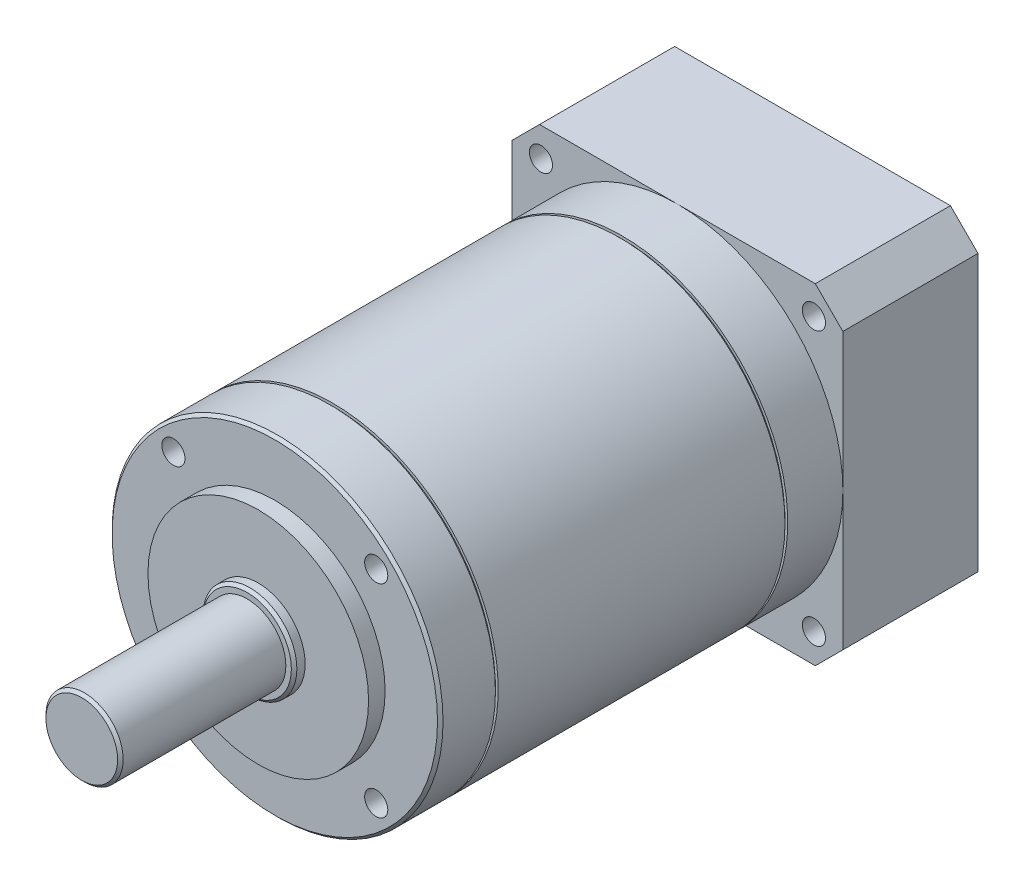
ISO-10303-21;
HEADER;
FILE_DESCRIPTION(('STEP AP214'),'2;1');
FILE_NAME('part.step','',(''),(''),'','','');
FILE_SCHEMA(('AUTOMOTIVE_DESIGN { 1 0 10303 214 1 1 1 1 }'));
ENDSEC;
DATA;
#1=APPLICATION_CONTEXT('core data for automotive mechanical design processes');
#2=APPLICATION_PROTOCOL_DEFINITION('international standard','automotive_design',2000,#1);
#3=PRODUCT_CONTEXT('',#1,'mechanical');
#4=PRODUCT('Part','Part','',(#3));
#5=PRODUCT_RELATED_PRODUCT_CATEGORY('part','',(#4));
#6=PRODUCT_DEFINITION_FORMATION('','',#4);
#7=PRODUCT_DEFINITION_CONTEXT('part definition',#1,'design');
#8=PRODUCT_DEFINITION('design','',#6,#7);
#9=PRODUCT_DEFINITION_SHAPE('','',#8);
#10=(LENGTH_UNIT() NAMED_UNIT(*) SI_UNIT(.MILLI.,.METRE.));
#11=(NAMED_UNIT(*) PLANE_ANGLE_UNIT() SI_UNIT($,.RADIAN.));
#12=(NAMED_UNIT(*) SI_UNIT($,.STERADIAN.) SOLID_ANGLE_UNIT());
#13=UNCERTAINTY_MEASURE_WITH_UNIT(LENGTH_MEASURE(1.E-05),#10,'distance_accuracy_value','');
#14=(GEOMETRIC_REPRESENTATION_CONTEXT(3) GLOBAL_UNCERTAINTY_ASSIGNED_CONTEXT((#13)) GLOBAL_UNIT_ASSIGNED_CONTEXT((#10,
#11,#12)) REPRESENTATION_CONTEXT('',''));
#15=CARTESIAN_POINT('',(0.,0.,0.));
#16=DIRECTION('',(0.,0.,1.));
#17=DIRECTION('',(1.,0.,0.));
#18=AXIS2_PLACEMENT_3D('',#15,#16,#17);
#19=CARTESIAN_POINT('',(0.,0.,100.5));
#20=DIRECTION('',(0.,0.,1.));
#21=DIRECTION('',(1.,0.,0.));
#22=AXIS2_PLACEMENT_3D('',#19,#20,#21);
#23=PLANE('',#22);
#24=CARTESIAN_POINT('',(0.,0.,100.5));
#25=DIRECTION('',(0.,0.,1.));
#26=DIRECTION('',(1.,0.,0.));
#27=AXIS2_PLACEMENT_3D('',#24,#25,#26);
#28=CIRCLE('',#27,20.);
#29=CARTESIAN_POINT('',(20.,0.,100.5));
#30=VERTEX_POINT('',#29);
#31=EDGE_CURVE('E168',#30,#30,#28,.T.);
#32=ORIENTED_EDGE('',*,*,#31,.T.);
#33=EDGE_LOOP('',(#32));
#34=FACE_BOUND('',#33,.T.);
#35=CARTESIAN_POINT('',(0.,0.,100.5));
#36=DIRECTION('',(0.,0.,1.));
#37=DIRECTION('',(1.,0.,0.));
#38=AXIS2_PLACEMENT_3D('',#35,#36,#37);
#39=CIRCLE('',#38,8.5);
#40=CARTESIAN_POINT('',(8.5,0.,100.5));
#41=VERTEX_POINT('',#40);
#42=EDGE_CURVE('E164',#41,#41,#39,.T.);
#43=ORIENTED_EDGE('',*,*,#42,.F.);
#44=EDGE_LOOP('',(#43));
#45=FACE_BOUND('',#44,.T.);
#46=ADVANCED_FACE('F41',(#34,#45),#23,.T.);
#47=CARTESIAN_POINT('',(0.,0.,97.5));
#48=DIRECTION('',(0.,0.,1.));
#49=DIRECTION('',(1.,0.,0.));
#50=AXIS2_PLACEMENT_3D('',#47,#48,#49);
#51=PLANE('',#50);
#52=CARTESIAN_POINT('',(0.,0.,97.5));
#53=DIRECTION('',(0.,0.,1.));
#54=DIRECTION('',(1.,0.,0.));
#55=AXIS2_PLACEMENT_3D('',#52,#53,#54);
#56=CIRCLE('',#55,29.5);
#57=CARTESIAN_POINT('',(29.5,0.,97.5));
#58=VERTEX_POINT('',#57);
#59=EDGE_CURVE('E283',#58,#58,#56,.T.);
#60=ORIENTED_EDGE('',*,*,#59,.T.);
#61=EDGE_LOOP('',(#60));
#62=FACE_BOUND('',#61,.T.);
#63=CARTESIAN_POINT('',(-18.38477631085,18.3847763108504,97.5));
#64=DIRECTION('',(0.,0.,1.));
#65=DIRECTION('',(1.,0.,0.));
#66=AXIS2_PLACEMENT_3D('',#63,#64,#65);
#67=CIRCLE('',#66,2.09999999999999);
#68=CARTESIAN_POINT('',(-16.28477631085,18.3847763108504,97.5));
#69=VERTEX_POINT('',#68);
#70=EDGE_CURVE('E140',#69,#69,#67,.T.);
#71=ORIENTED_EDGE('',*,*,#70,.F.);
#72=EDGE_LOOP('',(#71));
#73=FACE_BOUND('',#72,.T.);
#74=CARTESIAN_POINT('',(-18.3847763108502,-18.3847763108502,97.5));
#75=DIRECTION('',(0.,0.,1.));
#76=DIRECTION('',(1.,0.,0.));
#77=AXIS2_PLACEMENT_3D('',#74,#75,#76);
#78=CIRCLE('',#77,2.09999999999999);
#79=CARTESIAN_POINT('',(-16.2847763108503,-18.3847763108502,97.5));
#80=VERTEX_POINT('',#79);
#81=EDGE_CURVE('E139',#80,#80,#78,.T.);
#82=ORIENTED_EDGE('',*,*,#81,.F.);
#83=EDGE_LOOP('',(#82));
#84=FACE_BOUND('',#83,.T.);
#85=CARTESIAN_POINT('',(18.3847763108502,-18.3847763108503,97.5));
#86=DIRECTION('',(0.,0.,1.));
#87=DIRECTION('',(1.,0.,0.));
#88=AXIS2_PLACEMENT_3D('',#85,#86,#87);
#89=CIRCLE('',#88,2.09999999999999);
#90=CARTESIAN_POINT('',(20.4847763108502,-18.3847763108503,97.5));
#91=VERTEX_POINT('',#90);
#92=EDGE_CURVE('E152',#91,#91,#89,.T.);
#93=ORIENTED_EDGE('',*,*,#92,.F.);
#94=EDGE_LOOP('',(#93));
#95=FACE_BOUND('',#94,.T.);
#96=CARTESIAN_POINT('',(18.3847763108502,18.3847763108502,97.5));
#97=DIRECTION('',(0.,0.,1.));
#98=DIRECTION('',(1.,0.,0.));
#99=AXIS2_PLACEMENT_3D('',#96,#97,#98);
#100=CIRCLE('',#99,2.09999999999999);
#101=CARTESIAN_POINT('',(20.4847763108502,18.3847763108502,97.5));
#102=VERTEX_POINT('',#101);
#103=EDGE_CURVE('E158',#102,#102,#100,.T.);
#104=ORIENTED_EDGE('',*,*,#103,.F.);
#105=EDGE_LOOP('',(#104));
#106=FACE_BOUND('',#105,.T.);
#107=CARTESIAN_POINT('',(0.,0.,97.5));
#108=DIRECTION('',(0.,0.,1.));
#109=DIRECTION('',(1.,0.,0.));
#110=AXIS2_PLACEMENT_3D('',#107,#108,#109);
#111=CIRCLE('',#110,20.);
#112=CARTESIAN_POINT('',(20.,0.,97.5));
#113=VERTEX_POINT('',#112);
#114=EDGE_CURVE('E172',#113,#113,#111,.T.);
#115=ORIENTED_EDGE('',*,*,#114,.F.);
#116=EDGE_LOOP('',(#115));
#117=FACE_BOUND('',#116,.T.);
#118=ADVANCED_FACE('F303',(#62,#73,#84,#95,#106,#117),#51,.T.);
#119=CARTESIAN_POINT('',(0.,0.,97.5));
#120=DIRECTION('',(0.,0.,-1.));
#121=DIRECTION('',(-1.,0.,0.));
#122=AXIS2_PLACEMENT_3D('',#119,#120,#121);
#123=CYLINDRICAL_SURFACE('',#122,30.);
#124=CARTESIAN_POINT('',(0.,0.,35.));
#125=DIRECTION('',(0.,0.,1.));
#126=DIRECTION('',(1.,0.,0.));
#127=AXIS2_PLACEMENT_3D('',#124,#125,#126);
#128=CIRCLE('',#127,30.);
#129=CARTESIAN_POINT('',(30.,0.,35.));
#130=VERTEX_POINT('',#129);
#131=EDGE_CURVE('E185',#130,#130,#128,.T.);
#132=ORIENTED_EDGE('',*,*,#131,.T.);
#133=EDGE_LOOP('',(#132));
#134=FACE_BOUND('',#133,.T.);
#135=CARTESIAN_POINT('',(0.,0.,87.));
#136=DIRECTION('',(0.,0.,-1.));
#137=DIRECTION('',(-1.,0.,0.));
#138=AXIS2_PLACEMENT_3D('',#135,#136,#137);
#139=CIRCLE('',#138,30.);
#140=CARTESIAN_POINT('',(-30.,0.,87.));
#141=VERTEX_POINT('',#140);
#142=EDGE_CURVE('E188',#141,#141,#139,.T.);
#143=ORIENTED_EDGE('',*,*,#142,.T.);
#144=EDGE_LOOP('',(#143));
#145=FACE_BOUND('',#144,.T.);
#146=ADVANCED_FACE('F309',(#134,#145),#123,.T.);
#147=CARTESIAN_POINT('',(0.,33.268813429831,87.5));
#148=DIRECTION('',(0.,0.,1.));
#149=DIRECTION('',(1.,0.,0.));
#150=AXIS2_PLACEMENT_3D('',#147,#148,#149);
#151=PLANE('',#150);
#152=CARTESIAN_POINT('',(0.,0.,87.5));
#153=DIRECTION('',(0.,0.,-1.));
#154=DIRECTION('',(-1.,0.,0.));
#155=AXIS2_PLACEMENT_3D('',#152,#153,#154);
#156=CIRCLE('',#155,29.5);
#157=CARTESIAN_POINT('',(-29.5,0.,87.5));
#158=VERTEX_POINT('',#157);
#159=EDGE_CURVE('E184',#158,#158,#156,.T.);
#160=ORIENTED_EDGE('',*,*,#159,.F.);
#161=EDGE_LOOP('',(#160));
#162=FACE_BOUND('',#161,.T.);
#163=CARTESIAN_POINT('',(0.,0.,87.5));
#164=DIRECTION('',(0.,0.,1.));
#165=DIRECTION('',(1.,0.,0.));
#166=AXIS2_PLACEMENT_3D('',#163,#164,#165);
#167=CIRCLE('',#166,30.);
#168=CARTESIAN_POINT('',(30.,0.,87.5));
#169=VERTEX_POINT('',#168);
#170=EDGE_CURVE('E193',#169,#169,#167,.T.);
#171=ORIENTED_EDGE('',*,*,#170,.F.);
#172=EDGE_LOOP('',(#171));
#173=FACE_BOUND('',#172,.T.);
#174=ADVANCED_FACE('F348',(#162,#173),#151,.F.);
#175=CARTESIAN_POINT('',(0.,33.268813429831,87.));
#176=DIRECTION('',(0.,0.,-1.));
#177=DIRECTION('',(-1.,0.,0.));
#178=AXIS2_PLACEMENT_3D('',#175,#176,#177);
#179=PLANE('',#178);
#180=CARTESIAN_POINT('',(0.,0.,87.));
#181=DIRECTION('',(0.,0.,-1.));
#182=DIRECTION('',(-1.,0.,0.));
#183=AXIS2_PLACEMENT_3D('',#180,#181,#182);
#184=CIRCLE('',#183,29.5);
#185=CARTESIAN_POINT('',(-29.5,0.,87.));
#186=VERTEX_POINT('',#185);
#187=EDGE_CURVE('E181',#186,#186,#184,.T.);
#188=ORIENTED_EDGE('',*,*,#187,.T.);
#189=EDGE_LOOP('',(#188));
#190=FACE_BOUND('',#189,.T.);
#191=ORIENTED_EDGE('',*,*,#142,.F.);
#192=EDGE_LOOP('',(#191));
#193=FACE_BOUND('',#192,.T.);
#194=ADVANCED_FACE('F344',(#190,#193),#179,.F.);
#195=CARTESIAN_POINT('',(0.,0.,0.));
#196=DIRECTION('',(0.,0.,-1.));
#197=DIRECTION('',(-1.,0.,0.));
#198=AXIS2_PLACEMENT_3D('',#195,#196,#197);
#199=CYLINDRICAL_SURFACE('',#198,29.5);
#200=ORIENTED_EDGE('',*,*,#187,.F.);
#201=EDGE_LOOP('',(#200));
#202=FACE_BOUND('',#201,.T.);
#203=ORIENTED_EDGE('',*,*,#159,.T.);
#204=EDGE_LOOP('',(#203));
#205=FACE_BOUND('',#204,.T.);
#206=ADVANCED_FACE('F347',(#202,#205),#199,.T.);
#207=CARTESIAN_POINT('',(0.,0.,97.));
#208=DIRECTION('',(0.,0.,1.));
#209=DIRECTION('',(1.,0.,0.));
#210=AXIS2_PLACEMENT_3D('',#207,#208,#209);
#211=CIRCLE('',#210,30.);
#212=CARTESIAN_POINT('',(30.,0.,97.));
#213=VERTEX_POINT('',#212);
#214=EDGE_CURVE('E286',#213,#213,#211,.F.);
#215=ORIENTED_EDGE('',*,*,#214,.T.);
#216=EDGE_LOOP('',(#215));
#217=FACE_BOUND('',#216,.T.);
#218=ORIENTED_EDGE('',*,*,#170,.T.);
#219=EDGE_LOOP('',(#218));
#220=FACE_BOUND('',#219,.T.);
#221=ADVANCED_FACE('F342',(#217,#220),#123,.T.);
#222=CARTESIAN_POINT('',(0.,33.268813429831,35.));
#223=DIRECTION('',(0.,0.,1.));
#224=DIRECTION('',(1.,0.,0.));
#225=AXIS2_PLACEMENT_3D('',#222,#223,#224);
#226=PLANE('',#225);
#227=CARTESIAN_POINT('',(0.,0.,35.));
#228=DIRECTION('',(0.,0.,-1.));
#229=DIRECTION('',(-1.,0.,0.));
#230=AXIS2_PLACEMENT_3D('',#227,#228,#229);
#231=CIRCLE('',#230,29.5);
#232=CARTESIAN_POINT('',(-29.5,0.,35.));
#233=VERTEX_POINT('',#232);
#234=EDGE_CURVE('E177',#233,#233,#231,.T.);
#235=ORIENTED_EDGE('',*,*,#234,.F.);
#236=EDGE_LOOP('',(#235));
#237=FACE_BOUND('',#236,.T.);
#238=ORIENTED_EDGE('',*,*,#131,.F.);
#239=EDGE_LOOP('',(#238));
#240=FACE_BOUND('',#239,.T.);
#241=ADVANCED_FACE('F334',(#237,#240),#226,.F.);
#242=CARTESIAN_POINT('',(0.,33.268813429831,34.5));
#243=DIRECTION('',(0.,0.,-1.));
#244=DIRECTION('',(-1.,0.,0.));
#245=AXIS2_PLACEMENT_3D('',#242,#243,#244);
#246=PLANE('',#245);
#247=CARTESIAN_POINT('',(0.,0.,34.5));
#248=DIRECTION('',(0.,0.,-1.));
#249=DIRECTION('',(-1.,0.,0.));
#250=AXIS2_PLACEMENT_3D('',#247,#248,#249);
#251=CIRCLE('',#250,29.5);
#252=CARTESIAN_POINT('',(-29.5,0.,34.5));
#253=VERTEX_POINT('',#252);
#254=EDGE_CURVE('E171',#253,#253,#251,.T.);
#255=ORIENTED_EDGE('',*,*,#254,.T.);
#256=EDGE_LOOP('',(#255));
#257=FACE_BOUND('',#256,.T.);
#258=CARTESIAN_POINT('',(0.,0.,34.5));
#259=DIRECTION('',(0.,0.,-1.));
#260=DIRECTION('',(-1.,0.,0.));
#261=AXIS2_PLACEMENT_3D('',#258,#259,#260);
#262=CIRCLE('',#261,30.);
#263=CARTESIAN_POINT('',(-30.,0.,34.5));
#264=VERTEX_POINT('',#263);
#265=EDGE_CURVE('E180',#264,#264,#262,.T.);
#266=ORIENTED_EDGE('',*,*,#265,.F.);
#267=EDGE_LOOP('',(#266));
#268=FACE_BOUND('',#267,.T.);
#269=ADVANCED_FACE('F330',(#257,#268),#246,.F.);
#270=CARTESIAN_POINT('',(0.,0.,0.));
#271=DIRECTION('',(0.,0.,-1.));
#272=DIRECTION('',(-1.,0.,0.));
#273=AXIS2_PLACEMENT_3D('',#270,#271,#272);
#274=CYLINDRICAL_SURFACE('',#273,29.5);
#275=ORIENTED_EDGE('',*,*,#254,.F.);
#276=EDGE_LOOP('',(#275));
#277=FACE_BOUND('',#276,.T.);
#278=ORIENTED_EDGE('',*,*,#234,.T.);
#279=EDGE_LOOP('',(#278));
#280=FACE_BOUND('',#279,.T.);
#281=ADVANCED_FACE('F333',(#277,#280),#274,.T.);
#282=CARTESIAN_POINT('',(0.,0.,0.));
#283=DIRECTION('',(0.,0.,-1.));
#284=DIRECTION('',(-1.,0.,0.));
#285=AXIS2_PLACEMENT_3D('',#282,#283,#284);
#286=PLANE('',#285);
#287=CARTESIAN_POINT('',(-24.7487373415294,-24.7487373415289,0.));
#288=DIRECTION('',(0.,0.,-1.));
#289=DIRECTION('',(-1.,0.,0.));
#290=AXIS2_PLACEMENT_3D('',#287,#288,#289);
#291=CIRCLE('',#290,2.09999999999999);
#292=CARTESIAN_POINT('',(-26.8487373415294,-24.7487373415289,0.));
#293=VERTEX_POINT('',#292);
#294=EDGE_CURVE('E506',#293,#293,#291,.T.);
#295=ORIENTED_EDGE('',*,*,#294,.F.);
#296=EDGE_LOOP('',(#295));
#297=FACE_BOUND('',#296,.T.);
#298=CARTESIAN_POINT('',(24.7487373415292,-24.7487373415292,0.));
#299=DIRECTION('',(0.,0.,-1.));
#300=DIRECTION('',(-1.,0.,0.));
#301=AXIS2_PLACEMENT_3D('',#298,#299,#300);
#302=CIRCLE('',#301,2.09999999999999);
#303=CARTESIAN_POINT('',(22.6487373415292,-24.7487373415292,0.));
#304=VERTEX_POINT('',#303);
#305=EDGE_CURVE('E276',#304,#304,#302,.T.);
#306=ORIENTED_EDGE('',*,*,#305,.F.);
#307=EDGE_LOOP('',(#306));
#308=FACE_BOUND('',#307,.T.);
#309=CARTESIAN_POINT('',(24.7487373415293,24.7487373415291,0.));
#310=DIRECTION('',(0.,0.,-1.));
#311=DIRECTION('',(-1.,0.,0.));
#312=AXIS2_PLACEMENT_3D('',#309,#310,#311);
#313=CIRCLE('',#312,2.09999999999999);
#314=CARTESIAN_POINT('',(22.6487373415293,24.7487373415291,0.));
#315=VERTEX_POINT('',#314);
#316=EDGE_CURVE('E275',#315,#315,#313,.T.);
#317=ORIENTED_EDGE('',*,*,#316,.F.);
#318=EDGE_LOOP('',(#317));
#319=FACE_BOUND('',#318,.T.);
#320=CARTESIAN_POINT('',(-24.7487373415292,24.7487373415292,0.));
#321=DIRECTION('',(0.,0.,-1.));
#322=DIRECTION('',(-1.,0.,0.));
#323=AXIS2_PLACEMENT_3D('',#320,#321,#322);
#324=CIRCLE('',#323,2.09999999999999);
#325=CARTESIAN_POINT('',(-26.8487373415291,24.7487373415292,0.));
#326=VERTEX_POINT('',#325);
#327=EDGE_CURVE('E271',#326,#326,#324,.T.);
#328=ORIENTED_EDGE('',*,*,#327,.F.);
#329=EDGE_LOOP('',(#328));
#330=FACE_BOUND('',#329,.T.);
#331=DIRECTION('',(1.,0.,0.));
#332=VECTOR('',#331,1.);
#333=CARTESIAN_POINT('',(-30.,-30.,0.));
#334=LINE('',#333,#332);
#335=CARTESIAN_POINT('',(-25.,-30.,0.));
#336=VERTEX_POINT('',#335);
#337=CARTESIAN_POINT('',(25.,-30.,0.));
#338=VERTEX_POINT('',#337);
#339=EDGE_CURVE('E217',#336,#338,#334,.T.);
#340=ORIENTED_EDGE('',*,*,#339,.F.);
#341=DIRECTION('',(0.707106781186546,-0.707106781186549,0.));
#342=VECTOR('',#341,1.);
#343=CARTESIAN_POINT('',(-27.5,-27.4999999999999,0.));
#344=LINE('',#343,#342);
#345=CARTESIAN_POINT('',(-30.,-25.,0.));
#346=VERTEX_POINT('',#345);
#347=EDGE_CURVE('E231',#336,#346,#344,.F.);
#348=ORIENTED_EDGE('',*,*,#347,.T.);
#349=DIRECTION('',(0.,-1.,0.));
#350=VECTOR('',#349,1.);
#351=CARTESIAN_POINT('',(-30.,-30.,0.));
#352=LINE('',#351,#350);
#353=CARTESIAN_POINT('',(-30.,25.,0.));
#354=VERTEX_POINT('',#353);
#355=EDGE_CURVE('E214',#354,#346,#352,.T.);
#356=ORIENTED_EDGE('',*,*,#355,.F.);
#357=DIRECTION('',(-0.707106781186549,-0.707106781186546,0.));
#358=VECTOR('',#357,1.);
#359=CARTESIAN_POINT('',(-27.4999999999999,27.5,0.));
#360=LINE('',#359,#358);
#361=CARTESIAN_POINT('',(-25.,30.,0.));
#362=VERTEX_POINT('',#361);
#363=EDGE_CURVE('E225',#354,#362,#360,.F.);
#364=ORIENTED_EDGE('',*,*,#363,.T.);
#365=DIRECTION('',(-1.,0.,0.));
#366=VECTOR('',#365,1.);
#367=CARTESIAN_POINT('',(-30.,30.,0.));
#368=LINE('',#367,#366);
#369=CARTESIAN_POINT('',(25.,30.,0.));
#370=VERTEX_POINT('',#369);
#371=EDGE_CURVE('E211',#370,#362,#368,.T.);
#372=ORIENTED_EDGE('',*,*,#371,.F.);
#373=DIRECTION('',(-0.707106781186546,0.707106781186549,0.));
#374=VECTOR('',#373,1.);
#375=CARTESIAN_POINT('',(27.5,27.4999999999999,0.));
#376=LINE('',#375,#374);
#377=CARTESIAN_POINT('',(30.,25.,0.));
#378=VERTEX_POINT('',#377);
#379=EDGE_CURVE('E227',#370,#378,#376,.F.);
#380=ORIENTED_EDGE('',*,*,#379,.T.);
#381=DIRECTION('',(0.,1.,0.));
#382=VECTOR('',#381,1.);
#383=CARTESIAN_POINT('',(30.,-30.,0.));
#384=LINE('',#383,#382);
#385=CARTESIAN_POINT('',(30.,-25.,0.));
#386=VERTEX_POINT('',#385);
#387=EDGE_CURVE('E192',#386,#378,#384,.T.);
#388=ORIENTED_EDGE('',*,*,#387,.F.);
#389=DIRECTION('',(0.707106781186549,0.707106781186546,0.));
#390=VECTOR('',#389,1.);
#391=CARTESIAN_POINT('',(27.4999999999999,-27.5000000000001,0.));
#392=LINE('',#391,#390);
#393=EDGE_CURVE('E229',#386,#338,#392,.F.);
#394=ORIENTED_EDGE('',*,*,#393,.T.);
#395=EDGE_LOOP('',(#340,#348,#356,#364,#372,#380,#388,#394));
#396=FACE_BOUND('',#395,.T.);
#397=ADVANCED_FACE('F338',(#297,#308,#319,#330,#396),#286,.T.);
#398=CARTESIAN_POINT('',(30.,-25.,24.5));
#399=DIRECTION('',(-0.707106781186546,0.707106781186549,0.));
#400=DIRECTION('',(0.,0.,-1.));
#401=AXIS2_PLACEMENT_3D('',#398,#399,#400);
#402=PLANE('',#401);
#403=DIRECTION('',(-0.707106781186549,-0.707106781186546,0.));
#404=VECTOR('',#403,1.);
#405=CARTESIAN_POINT('',(30.,-25.,24.5));
#406=LINE('',#405,#404);
#407=CARTESIAN_POINT('',(25.,-30.,24.5));
#408=VERTEX_POINT('',#407);
#409=CARTESIAN_POINT('',(30.,-25.,24.5));
#410=VERTEX_POINT('',#409);
#411=EDGE_CURVE('E243',#408,#410,#406,.F.);
#412=ORIENTED_EDGE('',*,*,#411,.F.);
#413=DIRECTION('',(0.,0.,1.));
#414=VECTOR('',#413,1.);
#415=CARTESIAN_POINT('',(25.,-30.,24.5));
#416=LINE('',#415,#414);
#417=EDGE_CURVE('E208',#338,#408,#416,.T.);
#418=ORIENTED_EDGE('',*,*,#417,.F.);
#419=ORIENTED_EDGE('',*,*,#393,.F.);
#420=DIRECTION('',(0.,0.,-1.));
#421=VECTOR('',#420,1.);
#422=CARTESIAN_POINT('',(30.,-25.,24.5));
#423=LINE('',#422,#421);
#424=EDGE_CURVE('E250',#410,#386,#423,.T.);
#425=ORIENTED_EDGE('',*,*,#424,.F.);
#426=EDGE_LOOP('',(#412,#418,#419,#425));
#427=FACE_BOUND('',#426,.T.);
#428=ADVANCED_FACE('F367',(#427),#402,.F.);
#429=CARTESIAN_POINT('',(-30.,-30.,24.5));
#430=DIRECTION('',(0.,1.,0.));
#431=DIRECTION('',(0.,0.,1.));
#432=AXIS2_PLACEMENT_3D('',#429,#430,#431);
#433=PLANE('',#432);
#434=DIRECTION('',(1.,0.,0.));
#435=VECTOR('',#434,1.);
#436=CARTESIAN_POINT('',(-30.,-30.,24.5));
#437=LINE('',#436,#435);
#438=CARTESIAN_POINT('',(-25.,-30.,24.5));
#439=VERTEX_POINT('',#438);
#440=CARTESIAN_POINT('',(0.,-30.,24.5));
#441=VERTEX_POINT('',#440);
#442=EDGE_CURVE('E205',#439,#441,#437,.T.);
#443=ORIENTED_EDGE('',*,*,#442,.F.);
#444=DIRECTION('',(0.,0.,-1.));
#445=VECTOR('',#444,1.);
#446=CARTESIAN_POINT('',(-25.,-30.,24.5));
#447=LINE('',#446,#445);
#448=EDGE_CURVE('E222',#439,#336,#447,.T.);
#449=ORIENTED_EDGE('',*,*,#448,.T.);
#450=ORIENTED_EDGE('',*,*,#339,.T.);
#451=ORIENTED_EDGE('',*,*,#417,.T.);
#452=EDGE_CURVE('E204',#441,#408,#437,.T.);
#453=ORIENTED_EDGE('',*,*,#452,.F.);
#454=EDGE_LOOP('',(#443,#449,#450,#451,#453));
#455=FACE_BOUND('',#454,.T.);
#456=ADVANCED_FACE('F369',(#455),#433,.F.);
#457=CARTESIAN_POINT('',(-25.,-30.,24.5));
#458=DIRECTION('',(0.707106781186549,0.707106781186546,0.));
#459=DIRECTION('',(0.,0.,-1.));
#460=AXIS2_PLACEMENT_3D('',#457,#458,#459);
#461=PLANE('',#460);
#462=DIRECTION('',(-0.707106781186546,0.707106781186549,0.));
#463=VECTOR('',#462,1.);
#464=CARTESIAN_POINT('',(-25.,-30.,24.5));
#465=LINE('',#464,#463);
#466=CARTESIAN_POINT('',(-30.,-25.,24.5));
#467=VERTEX_POINT('',#466);
#468=EDGE_CURVE('E245',#467,#439,#465,.F.);
#469=ORIENTED_EDGE('',*,*,#468,.F.);
#470=DIRECTION('',(0.,0.,1.));
#471=VECTOR('',#470,1.);
#472=CARTESIAN_POINT('',(-30.,-25.,24.5));
#473=LINE('',#472,#471);
#474=EDGE_CURVE('E236',#346,#467,#473,.T.);
#475=ORIENTED_EDGE('',*,*,#474,.F.);
#476=ORIENTED_EDGE('',*,*,#347,.F.);
#477=ORIENTED_EDGE('',*,*,#448,.F.);
#478=EDGE_LOOP('',(#469,#475,#476,#477));
#479=FACE_BOUND('',#478,.T.);
#480=ADVANCED_FACE('F372',(#479),#461,.F.);
#481=CARTESIAN_POINT('',(-30.,-30.,24.5));
#482=DIRECTION('',(1.,0.,0.));
#483=DIRECTION('',(0.,0.,-1.));
#484=AXIS2_PLACEMENT_3D('',#481,#482,#483);
#485=PLANE('',#484);
#486=ORIENTED_EDGE('',*,*,#355,.T.);
#487=ORIENTED_EDGE('',*,*,#474,.T.);
#488=DIRECTION('',(0.,-1.,0.));
#489=VECTOR('',#488,1.);
#490=CARTESIAN_POINT('',(-30.,-30.,24.5));
#491=LINE('',#490,#489);
#492=CARTESIAN_POINT('',(-30.,0.,24.5));
#493=VERTEX_POINT('',#492);
#494=EDGE_CURVE('E201',#493,#467,#491,.T.);
#495=ORIENTED_EDGE('',*,*,#494,.F.);
#496=CARTESIAN_POINT('',(-30.,25.,24.5));
#497=VERTEX_POINT('',#496);
#498=EDGE_CURVE('E202',#497,#493,#491,.T.);
#499=ORIENTED_EDGE('',*,*,#498,.F.);
#500=DIRECTION('',(0.,0.,-1.));
#501=VECTOR('',#500,1.);
#502=CARTESIAN_POINT('',(-30.,25.,24.5));
#503=LINE('',#502,#501);
#504=EDGE_CURVE('E233',#497,#354,#503,.T.);
#505=ORIENTED_EDGE('',*,*,#504,.T.);
#506=EDGE_LOOP('',(#486,#487,#495,#499,#505));
#507=FACE_BOUND('',#506,.T.);
#508=ADVANCED_FACE('F374',(#507),#485,.F.);
#509=CARTESIAN_POINT('',(-30.,25.,24.5));
#510=DIRECTION('',(0.707106781186546,-0.707106781186549,0.));
#511=DIRECTION('',(0.,0.,-1.));
#512=AXIS2_PLACEMENT_3D('',#509,#510,#511);
#513=PLANE('',#512);
#514=DIRECTION('',(0.707106781186549,0.707106781186546,0.));
#515=VECTOR('',#514,1.);
#516=CARTESIAN_POINT('',(-30.,25.,24.5));
#517=LINE('',#516,#515);
#518=CARTESIAN_POINT('',(-25.,30.,24.5));
#519=VERTEX_POINT('',#518);
#520=EDGE_CURVE('E239',#519,#497,#517,.F.);
#521=ORIENTED_EDGE('',*,*,#520,.F.);
#522=DIRECTION('',(0.,0.,1.));
#523=VECTOR('',#522,1.);
#524=CARTESIAN_POINT('',(-25.,30.,24.5));
#525=LINE('',#524,#523);
#526=EDGE_CURVE('E253',#362,#519,#525,.T.);
#527=ORIENTED_EDGE('',*,*,#526,.F.);
#528=ORIENTED_EDGE('',*,*,#363,.F.);
#529=ORIENTED_EDGE('',*,*,#504,.F.);
#530=EDGE_LOOP('',(#521,#527,#528,#529));
#531=FACE_BOUND('',#530,.T.);
#532=ADVANCED_FACE('F377',(#531),#513,.F.);
#533=CARTESIAN_POINT('',(-30.,30.,24.5));
#534=DIRECTION('',(0.,-1.,0.));
#535=DIRECTION('',(0.,0.,-1.));
#536=AXIS2_PLACEMENT_3D('',#533,#534,#535);
#537=PLANE('',#536);
#538=DIRECTION('',(-1.,0.,0.));
#539=VECTOR('',#538,1.);
#540=CARTESIAN_POINT('',(-30.,30.,24.5));
#541=LINE('',#540,#539);
#542=CARTESIAN_POINT('',(25.,30.,24.5));
#543=VERTEX_POINT('',#542);
#544=CARTESIAN_POINT('',(0.,30.,24.5));
#545=VERTEX_POINT('',#544);
#546=EDGE_CURVE('E198',#543,#545,#541,.T.);
#547=ORIENTED_EDGE('',*,*,#546,.F.);
#548=DIRECTION('',(0.,0.,-1.));
#549=VECTOR('',#548,1.);
#550=CARTESIAN_POINT('',(25.,30.,24.5));
#551=LINE('',#550,#549);
#552=EDGE_CURVE('E256',#543,#370,#551,.T.);
#553=ORIENTED_EDGE('',*,*,#552,.T.);
#554=ORIENTED_EDGE('',*,*,#371,.T.);
#555=ORIENTED_EDGE('',*,*,#526,.T.);
#556=EDGE_CURVE('E196',#545,#519,#541,.T.);
#557=ORIENTED_EDGE('',*,*,#556,.F.);
#558=EDGE_LOOP('',(#547,#553,#554,#555,#557));
#559=FACE_BOUND('',#558,.T.);
#560=ADVANCED_FACE('F379',(#559),#537,.F.);
#561=CARTESIAN_POINT('',(25.,30.,24.5));
#562=DIRECTION('',(-0.707106781186549,-0.707106781186546,0.));
#563=DIRECTION('',(0.,0.,-1.));
#564=AXIS2_PLACEMENT_3D('',#561,#562,#563);
#565=PLANE('',#564);
#566=DIRECTION('',(0.707106781186546,-0.707106781186549,0.));
#567=VECTOR('',#566,1.);
#568=CARTESIAN_POINT('',(25.,30.,24.5));
#569=LINE('',#568,#567);
#570=CARTESIAN_POINT('',(30.,25.,24.5));
#571=VERTEX_POINT('',#570);
#572=EDGE_CURVE('E241',#571,#543,#569,.F.);
#573=ORIENTED_EDGE('',*,*,#572,.F.);
#574=DIRECTION('',(0.,0.,1.));
#575=VECTOR('',#574,1.);
#576=CARTESIAN_POINT('',(30.,25.,24.5));
#577=LINE('',#576,#575);
#578=EDGE_CURVE('E247',#378,#571,#577,.T.);
#579=ORIENTED_EDGE('',*,*,#578,.F.);
#580=ORIENTED_EDGE('',*,*,#379,.F.);
#581=ORIENTED_EDGE('',*,*,#552,.F.);
#582=EDGE_LOOP('',(#573,#579,#580,#581));
#583=FACE_BOUND('',#582,.T.);
#584=ADVANCED_FACE('F382',(#583),#565,.F.);
#585=CARTESIAN_POINT('',(30.,-30.,24.5));
#586=DIRECTION('',(-1.,0.,0.));
#587=DIRECTION('',(0.,0.,1.));
#588=AXIS2_PLACEMENT_3D('',#585,#586,#587);
#589=PLANE('',#588);
#590=DIRECTION('',(0.,1.,0.));
#591=VECTOR('',#590,1.);
#592=CARTESIAN_POINT('',(30.,-30.,24.5));
#593=LINE('',#592,#591);
#594=CARTESIAN_POINT('',(30.,0.,24.5));
#595=VERTEX_POINT('',#594);
#596=EDGE_CURVE('E194',#410,#595,#593,.T.);
#597=ORIENTED_EDGE('',*,*,#596,.F.);
#598=ORIENTED_EDGE('',*,*,#424,.T.);
#599=ORIENTED_EDGE('',*,*,#387,.T.);
#600=ORIENTED_EDGE('',*,*,#578,.T.);
#601=EDGE_CURVE('E197',#595,#571,#593,.T.);
#602=ORIENTED_EDGE('',*,*,#601,.F.);
#603=EDGE_LOOP('',(#597,#598,#599,#600,#602));
#604=FACE_BOUND('',#603,.T.);
#605=ADVANCED_FACE('F384',(#604),#589,.F.);
#606=CARTESIAN_POINT('',(0.,0.,24.5));
#607=DIRECTION('',(0.,0.,-1.));
#608=DIRECTION('',(-1.,0.,0.));
#609=AXIS2_PLACEMENT_3D('',#606,#607,#608);
#610=PLANE('',#609);
#611=CARTESIAN_POINT('',(24.7487373415292,-24.7487373415292,24.5));
#612=DIRECTION('',(0.,0.,-1.));
#613=DIRECTION('',(-1.,0.,0.));
#614=AXIS2_PLACEMENT_3D('',#611,#612,#613);
#615=CIRCLE('',#614,2.09999999999999);
#616=CARTESIAN_POINT('',(22.6487373415292,-24.7487373415292,24.5));
#617=VERTEX_POINT('',#616);
#618=EDGE_CURVE('E272',#617,#617,#615,.T.);
#619=ORIENTED_EDGE('',*,*,#618,.T.);
#620=EDGE_LOOP('',(#619));
#621=FACE_BOUND('',#620,.T.);
#622=CARTESIAN_POINT('',(0.,0.,24.5));
#623=DIRECTION('',(0.,0.,1.));
#624=DIRECTION('',(1.,0.,0.));
#625=AXIS2_PLACEMENT_3D('',#622,#623,#624);
#626=CIRCLE('',#625,30.);
#627=EDGE_CURVE('E64',#441,#595,#626,.T.);
#628=ORIENTED_EDGE('',*,*,#627,.F.);
#629=ORIENTED_EDGE('',*,*,#452,.T.);
#630=ORIENTED_EDGE('',*,*,#411,.T.);
#631=ORIENTED_EDGE('',*,*,#596,.T.);
#632=EDGE_LOOP('',(#628,#629,#630,#631));
#633=FACE_BOUND('',#632,.T.);
#634=ADVANCED_FACE('F364',(#621,#633),#610,.F.);
#635=CARTESIAN_POINT('',(-24.7487373415294,-24.7487373415289,24.5));
#636=DIRECTION('',(0.,0.,-1.));
#637=DIRECTION('',(-1.,0.,0.));
#638=AXIS2_PLACEMENT_3D('',#635,#636,#637);
#639=CIRCLE('',#638,2.09999999999999);
#640=CARTESIAN_POINT('',(-26.8487373415294,-24.7487373415289,24.5));
#641=VERTEX_POINT('',#640);
#642=EDGE_CURVE('E476',#641,#641,#639,.T.);
#643=ORIENTED_EDGE('',*,*,#642,.T.);
#644=EDGE_LOOP('',(#643));
#645=FACE_BOUND('',#644,.T.);
#646=EDGE_CURVE('E478',#493,#441,#626,.T.);
#647=ORIENTED_EDGE('',*,*,#646,.F.);
#648=ORIENTED_EDGE('',*,*,#494,.T.);
#649=ORIENTED_EDGE('',*,*,#468,.T.);
#650=ORIENTED_EDGE('',*,*,#442,.T.);
#651=EDGE_LOOP('',(#647,#648,#649,#650));
#652=FACE_BOUND('',#651,.T.);
#653=ADVANCED_FACE('F464',(#645,#652),#610,.F.);
#654=CARTESIAN_POINT('',(-24.7487373415292,24.7487373415292,24.5));
#655=DIRECTION('',(0.,0.,-1.));
#656=DIRECTION('',(-1.,0.,0.));
#657=AXIS2_PLACEMENT_3D('',#654,#655,#656);
#658=CIRCLE('',#657,2.09999999999999);
#659=CARTESIAN_POINT('',(-26.8487373415291,24.7487373415292,24.5));
#660=VERTEX_POINT('',#659);
#661=EDGE_CURVE('E146',#660,#660,#658,.T.);
#662=ORIENTED_EDGE('',*,*,#661,.T.);
#663=EDGE_LOOP('',(#662));
#664=FACE_BOUND('',#663,.T.);
#665=EDGE_CURVE('E56',#545,#493,#626,.T.);
#666=ORIENTED_EDGE('',*,*,#665,.F.);
#667=ORIENTED_EDGE('',*,*,#556,.T.);
#668=ORIENTED_EDGE('',*,*,#520,.T.);
#669=ORIENTED_EDGE('',*,*,#498,.T.);
#670=EDGE_LOOP('',(#666,#667,#668,#669));
#671=FACE_BOUND('',#670,.T.);
#672=ADVANCED_FACE('F362',(#664,#671),#610,.F.);
#673=CARTESIAN_POINT('',(24.7487373415293,24.7487373415291,24.5));
#674=DIRECTION('',(0.,0.,-1.));
#675=DIRECTION('',(-1.,0.,0.));
#676=AXIS2_PLACEMENT_3D('',#673,#674,#675);
#677=CIRCLE('',#676,2.09999999999999);
#678=CARTESIAN_POINT('',(22.6487373415293,24.7487373415291,24.5));
#679=VERTEX_POINT('',#678);
#680=EDGE_CURVE('E514',#679,#679,#677,.T.);
#681=ORIENTED_EDGE('',*,*,#680,.T.);
#682=EDGE_LOOP('',(#681));
#683=FACE_BOUND('',#682,.T.);
#684=EDGE_CURVE('E189',#595,#545,#626,.T.);
#685=ORIENTED_EDGE('',*,*,#684,.F.);
#686=ORIENTED_EDGE('',*,*,#601,.T.);
#687=ORIENTED_EDGE('',*,*,#572,.T.);
#688=ORIENTED_EDGE('',*,*,#546,.T.);
#689=EDGE_LOOP('',(#685,#686,#687,#688));
#690=FACE_BOUND('',#689,.T.);
#691=ADVANCED_FACE('F358',(#683,#690),#610,.F.);
#692=ORIENTED_EDGE('',*,*,#265,.T.);
#693=EDGE_LOOP('',(#692));
#694=FACE_BOUND('',#693,.T.);
#695=ORIENTED_EDGE('',*,*,#684,.T.);
#696=ORIENTED_EDGE('',*,*,#665,.T.);
#697=ORIENTED_EDGE('',*,*,#646,.T.);
#698=ORIENTED_EDGE('',*,*,#627,.T.);
#699=EDGE_LOOP('',(#695,#696,#697,#698));
#700=FACE_BOUND('',#699,.T.);
#701=ADVANCED_FACE('F321',(#694,#700),#123,.T.);
#702=CARTESIAN_POINT('',(0.,0.,100.5));
#703=DIRECTION('',(0.,0.,-1.));
#704=DIRECTION('',(-1.,0.,0.));
#705=AXIS2_PLACEMENT_3D('',#702,#703,#704);
#706=CYLINDRICAL_SURFACE('',#705,20.);
#707=ORIENTED_EDGE('',*,*,#31,.F.);
#708=EDGE_LOOP('',(#707));
#709=FACE_BOUND('',#708,.T.);
#710=ORIENTED_EDGE('',*,*,#114,.T.);
#711=EDGE_LOOP('',(#710));
#712=FACE_BOUND('',#711,.T.);
#713=ADVANCED_FACE('F317',(#709,#712),#706,.T.);
#714=CARTESIAN_POINT('',(0.,0.,102.5));
#715=DIRECTION('',(0.,0.,1.));
#716=DIRECTION('',(1.,0.,0.));
#717=AXIS2_PLACEMENT_3D('',#714,#715,#716);
#718=PLANE('',#717);
#719=CARTESIAN_POINT('',(0.,0.,102.5));
#720=DIRECTION('',(0.,0.,1.));
#721=DIRECTION('',(1.,0.,0.));
#722=AXIS2_PLACEMENT_3D('',#719,#720,#721);
#723=CIRCLE('',#722,8.00000000000001);
#724=CARTESIAN_POINT('',(8.00000000000001,0.,102.5));
#725=VERTEX_POINT('',#724);
#726=EDGE_CURVE('E277',#725,#725,#723,.T.);
#727=ORIENTED_EDGE('',*,*,#726,.T.);
#728=EDGE_LOOP('',(#727));
#729=FACE_BOUND('',#728,.T.);
#730=CARTESIAN_POINT('',(0.,0.,102.5));
#731=DIRECTION('',(0.,0.,1.));
#732=DIRECTION('',(1.,0.,0.));
#733=AXIS2_PLACEMENT_3D('',#730,#731,#732);
#734=CIRCLE('',#733,7.);
#735=CARTESIAN_POINT('',(7.,0.,102.5));
#736=VERTEX_POINT('',#735);
#737=EDGE_CURVE('E167',#736,#736,#734,.T.);
#738=ORIENTED_EDGE('',*,*,#737,.F.);
#739=EDGE_LOOP('',(#738));
#740=FACE_BOUND('',#739,.T.);
#741=ADVANCED_FACE('F320',(#729,#740),#718,.T.);
#742=CARTESIAN_POINT('',(0.,0.,102.5));
#743=DIRECTION('',(0.,0.,-1.));
#744=DIRECTION('',(-1.,0.,0.));
#745=AXIS2_PLACEMENT_3D('',#742,#743,#744);
#746=CYLINDRICAL_SURFACE('',#745,8.5);
#747=CARTESIAN_POINT('',(0.,0.,102.));
#748=DIRECTION('',(0.,0.,1.));
#749=DIRECTION('',(1.,0.,0.));
#750=AXIS2_PLACEMENT_3D('',#747,#748,#749);
#751=CIRCLE('',#750,8.5);
#752=CARTESIAN_POINT('',(8.5,0.,102.));
#753=VERTEX_POINT('',#752);
#754=EDGE_CURVE('E280',#753,#753,#751,.F.);
#755=ORIENTED_EDGE('',*,*,#754,.T.);
#756=EDGE_LOOP('',(#755));
#757=FACE_BOUND('',#756,.T.);
#758=ORIENTED_EDGE('',*,*,#42,.T.);
#759=EDGE_LOOP('',(#758));
#760=FACE_BOUND('',#759,.T.);
#761=ADVANCED_FACE('F315',(#757,#760),#746,.T.);
#762=CARTESIAN_POINT('',(0.,0.,132.5));
#763=DIRECTION('',(0.,0.,1.));
#764=DIRECTION('',(1.,0.,0.));
#765=AXIS2_PLACEMENT_3D('',#762,#763,#764);
#766=PLANE('',#765);
#767=CARTESIAN_POINT('',(0.,0.,132.5));
#768=DIRECTION('',(0.,0.,1.));
#769=DIRECTION('',(1.,0.,0.));
#770=AXIS2_PLACEMENT_3D('',#767,#768,#769);
#771=CIRCLE('',#770,6.49999999999999);
#772=CARTESIAN_POINT('',(6.49999999999999,0.,132.5));
#773=VERTEX_POINT('',#772);
#774=EDGE_CURVE('E49',#773,#773,#771,.T.);
#775=ORIENTED_EDGE('',*,*,#774,.T.);
#776=EDGE_LOOP('',(#775));
#777=FACE_BOUND('',#776,.T.);
#778=ADVANCED_FACE('F291',(#777),#766,.T.);
#779=CARTESIAN_POINT('',(0.,0.,132.5));
#780=DIRECTION('',(0.,0.,-1.));
#781=DIRECTION('',(-1.,0.,0.));
#782=AXIS2_PLACEMENT_3D('',#779,#780,#781);
#783=CYLINDRICAL_SURFACE('',#782,7.);
#784=CARTESIAN_POINT('',(0.,0.,132.));
#785=DIRECTION('',(0.,0.,1.));
#786=DIRECTION('',(1.,0.,0.));
#787=AXIS2_PLACEMENT_3D('',#784,#785,#786);
#788=CIRCLE('',#787,7.);
#789=CARTESIAN_POINT('',(7.,0.,132.));
#790=VERTEX_POINT('',#789);
#791=EDGE_CURVE('E11',#790,#790,#788,.F.);
#792=ORIENTED_EDGE('',*,*,#791,.T.);
#793=EDGE_LOOP('',(#792));
#794=FACE_BOUND('',#793,.T.);
#795=ORIENTED_EDGE('',*,*,#737,.T.);
#796=EDGE_LOOP('',(#795));
#797=FACE_BOUND('',#796,.T.);
#798=ADVANCED_FACE('F325',(#794,#797),#783,.T.);
#799=CARTESIAN_POINT('',(18.3847763108502,18.3847763108502,85.1));
#800=DIRECTION('',(0.,0.,1.));
#801=DIRECTION('',(1.,0.,0.));
#802=AXIS2_PLACEMENT_3D('',#799,#800,#801);
#803=CONICAL_SURFACE('',#802,2.1,1.02974425867665);
#804=CARTESIAN_POINT('',(18.3847763108502,18.3847763108502,83.8381927000421));
#805=VERTEX_POINT('',#804);
#806=VERTEX_LOOP('',#805);
#807=FACE_BOUND('',#806,.T.);
#808=CARTESIAN_POINT('',(18.3847763108502,18.3847763108502,85.1));
#809=DIRECTION('',(0.,0.,1.));
#810=DIRECTION('',(1.,0.,0.));
#811=AXIS2_PLACEMENT_3D('',#808,#809,#810);
#812=CIRCLE('',#811,2.1);
#813=CARTESIAN_POINT('',(20.4847763108502,18.3847763108502,85.1));
#814=VERTEX_POINT('',#813);
#815=EDGE_CURVE('E161',#814,#814,#812,.T.);
#816=ORIENTED_EDGE('',*,*,#815,.T.);
#817=EDGE_LOOP('',(#816));
#818=FACE_BOUND('',#817,.T.);
#819=ADVANCED_FACE('F328',(#807,#818),#803,.F.);
#820=CARTESIAN_POINT('',(18.3847763108502,18.3847763108502,97.5));
#821=DIRECTION('',(0.,0.,1.));
#822=DIRECTION('',(1.,0.,0.));
#823=AXIS2_PLACEMENT_3D('',#820,#821,#822);
#824=CYLINDRICAL_SURFACE('',#823,2.09999999999999);
#825=ORIENTED_EDGE('',*,*,#815,.F.);
#826=EDGE_LOOP('',(#825));
#827=FACE_BOUND('',#826,.T.);
#828=ORIENTED_EDGE('',*,*,#103,.T.);
#829=EDGE_LOOP('',(#828));
#830=FACE_BOUND('',#829,.T.);
#831=ADVANCED_FACE('F424',(#827,#830),#824,.F.);
#832=CARTESIAN_POINT('',(18.3847763108502,-18.3847763108503,85.1));
#833=DIRECTION('',(0.,0.,1.));
#834=DIRECTION('',(1.,0.,0.));
#835=AXIS2_PLACEMENT_3D('',#832,#833,#834);
#836=CONICAL_SURFACE('',#835,2.1,1.02974425867665);
#837=CARTESIAN_POINT('',(18.3847763108502,-18.3847763108503,83.8381927000421));
#838=VERTEX_POINT('',#837);
#839=VERTEX_LOOP('',#838);
#840=FACE_BOUND('',#839,.T.);
#841=CARTESIAN_POINT('',(18.3847763108502,-18.3847763108503,85.1));
#842=DIRECTION('',(0.,0.,1.));
#843=DIRECTION('',(1.,0.,0.));
#844=AXIS2_PLACEMENT_3D('',#841,#842,#843);
#845=CIRCLE('',#844,2.1);
#846=CARTESIAN_POINT('',(20.4847763108502,-18.3847763108503,85.1));
#847=VERTEX_POINT('',#846);
#848=EDGE_CURVE('E155',#847,#847,#845,.T.);
#849=ORIENTED_EDGE('',*,*,#848,.T.);
#850=EDGE_LOOP('',(#849));
#851=FACE_BOUND('',#850,.T.);
#852=ADVANCED_FACE('F428',(#840,#851),#836,.F.);
#853=CARTESIAN_POINT('',(18.3847763108502,-18.3847763108503,97.5));
#854=DIRECTION('',(0.,0.,1.));
#855=DIRECTION('',(1.,0.,0.));
#856=AXIS2_PLACEMENT_3D('',#853,#854,#855);
#857=CYLINDRICAL_SURFACE('',#856,2.09999999999999);
#858=ORIENTED_EDGE('',*,*,#848,.F.);
#859=EDGE_LOOP('',(#858));
#860=FACE_BOUND('',#859,.T.);
#861=ORIENTED_EDGE('',*,*,#92,.T.);
#862=EDGE_LOOP('',(#861));
#863=FACE_BOUND('',#862,.T.);
#864=ADVANCED_FACE('F432',(#860,#863),#857,.F.);
#865=CARTESIAN_POINT('',(-18.3847763108502,-18.3847763108502,85.1));
#866=DIRECTION('',(0.,0.,1.));
#867=DIRECTION('',(1.,0.,0.));
#868=AXIS2_PLACEMENT_3D('',#865,#866,#867);
#869=CONICAL_SURFACE('',#868,2.1,1.02974425867665);
#870=CARTESIAN_POINT('',(-18.3847763108502,-18.3847763108502,83.8381927000421));
#871=VERTEX_POINT('',#870);
#872=VERTEX_LOOP('',#871);
#873=FACE_BOUND('',#872,.T.);
#874=CARTESIAN_POINT('',(-18.3847763108502,-18.3847763108502,85.1));
#875=DIRECTION('',(0.,0.,1.));
#876=DIRECTION('',(1.,0.,0.));
#877=AXIS2_PLACEMENT_3D('',#874,#875,#876);
#878=CIRCLE('',#877,2.1);
#879=CARTESIAN_POINT('',(-16.2847763108502,-18.3847763108502,85.1));
#880=VERTEX_POINT('',#879);
#881=EDGE_CURVE('E143',#880,#880,#878,.T.);
#882=ORIENTED_EDGE('',*,*,#881,.T.);
#883=EDGE_LOOP('',(#882));
#884=FACE_BOUND('',#883,.T.);
#885=ADVANCED_FACE('F436',(#873,#884),#869,.F.);
#886=CARTESIAN_POINT('',(-18.3847763108502,-18.3847763108502,97.5));
#887=DIRECTION('',(0.,0.,1.));
#888=DIRECTION('',(1.,0.,0.));
#889=AXIS2_PLACEMENT_3D('',#886,#887,#888);
#890=CYLINDRICAL_SURFACE('',#889,2.09999999999999);
#891=ORIENTED_EDGE('',*,*,#881,.F.);
#892=EDGE_LOOP('',(#891));
#893=FACE_BOUND('',#892,.T.);
#894=ORIENTED_EDGE('',*,*,#81,.T.);
#895=EDGE_LOOP('',(#894));
#896=FACE_BOUND('',#895,.T.);
#897=ADVANCED_FACE('F133',(#893,#896),#890,.F.);
#898=CARTESIAN_POINT('',(-18.38477631085,18.3847763108504,85.1));
#899=DIRECTION('',(0.,0.,1.));
#900=DIRECTION('',(1.,0.,0.));
#901=AXIS2_PLACEMENT_3D('',#898,#899,#900);
#902=CONICAL_SURFACE('',#901,2.1,1.02974425867665);
#903=CARTESIAN_POINT('',(-18.38477631085,18.3847763108504,83.8381927000421));
#904=VERTEX_POINT('',#903);
#905=VERTEX_LOOP('',#904);
#906=FACE_BOUND('',#905,.T.);
#907=CARTESIAN_POINT('',(-18.38477631085,18.3847763108504,85.1));
#908=DIRECTION('',(0.,0.,1.));
#909=DIRECTION('',(1.,0.,0.));
#910=AXIS2_PLACEMENT_3D('',#907,#908,#909);
#911=CIRCLE('',#910,2.1);
#912=CARTESIAN_POINT('',(-16.28477631085,18.3847763108504,85.1));
#913=VERTEX_POINT('',#912);
#914=EDGE_CURVE('E137',#913,#913,#911,.T.);
#915=ORIENTED_EDGE('',*,*,#914,.T.);
#916=EDGE_LOOP('',(#915));
#917=FACE_BOUND('',#916,.T.);
#918=ADVANCED_FACE('F129',(#906,#917),#902,.F.);
#919=CARTESIAN_POINT('',(-18.38477631085,18.3847763108504,97.5));
#920=DIRECTION('',(0.,0.,1.));
#921=DIRECTION('',(1.,0.,0.));
#922=AXIS2_PLACEMENT_3D('',#919,#920,#921);
#923=CYLINDRICAL_SURFACE('',#922,2.09999999999999);
#924=ORIENTED_EDGE('',*,*,#914,.F.);
#925=EDGE_LOOP('',(#924));
#926=FACE_BOUND('',#925,.T.);
#927=ORIENTED_EDGE('',*,*,#70,.T.);
#928=EDGE_LOOP('',(#927));
#929=FACE_BOUND('',#928,.T.);
#930=ADVANCED_FACE('F132',(#926,#929),#923,.F.);
#931=CARTESIAN_POINT('',(-24.7487373415292,24.7487373415292,0.));
#932=DIRECTION('',(0.,0.,-1.));
#933=DIRECTION('',(-1.,0.,0.));
#934=AXIS2_PLACEMENT_3D('',#931,#932,#933);
#935=CYLINDRICAL_SURFACE('',#934,2.09999999999999);
#936=ORIENTED_EDGE('',*,*,#327,.T.);
#937=EDGE_LOOP('',(#936));
#938=FACE_BOUND('',#937,.T.);
#939=ORIENTED_EDGE('',*,*,#661,.F.);
#940=EDGE_LOOP('',(#939));
#941=FACE_BOUND('',#940,.T.);
#942=ADVANCED_FACE('F446',(#938,#941),#935,.F.);
#943=CARTESIAN_POINT('',(24.7487373415293,24.7487373415291,0.));
#944=DIRECTION('',(0.,0.,-1.));
#945=DIRECTION('',(-1.,0.,0.));
#946=AXIS2_PLACEMENT_3D('',#943,#944,#945);
#947=CYLINDRICAL_SURFACE('',#946,2.09999999999999);
#948=ORIENTED_EDGE('',*,*,#316,.T.);
#949=EDGE_LOOP('',(#948));
#950=FACE_BOUND('',#949,.T.);
#951=ORIENTED_EDGE('',*,*,#680,.F.);
#952=EDGE_LOOP('',(#951));
#953=FACE_BOUND('',#952,.T.);
#954=ADVANCED_FACE('F449',(#950,#953),#947,.F.);
#955=CARTESIAN_POINT('',(24.7487373415292,-24.7487373415292,0.));
#956=DIRECTION('',(0.,0.,-1.));
#957=DIRECTION('',(-1.,0.,0.));
#958=AXIS2_PLACEMENT_3D('',#955,#956,#957);
#959=CYLINDRICAL_SURFACE('',#958,2.09999999999999);
#960=ORIENTED_EDGE('',*,*,#305,.T.);
#961=EDGE_LOOP('',(#960));
#962=FACE_BOUND('',#961,.T.);
#963=ORIENTED_EDGE('',*,*,#618,.F.);
#964=EDGE_LOOP('',(#963));
#965=FACE_BOUND('',#964,.T.);
#966=ADVANCED_FACE('F406',(#962,#965),#959,.F.);
#967=CARTESIAN_POINT('',(-24.7487373415294,-24.7487373415289,0.));
#968=DIRECTION('',(0.,0.,-1.));
#969=DIRECTION('',(-1.,0.,0.));
#970=AXIS2_PLACEMENT_3D('',#967,#968,#969);
#971=CYLINDRICAL_SURFACE('',#970,2.09999999999999);
#972=ORIENTED_EDGE('',*,*,#294,.T.);
#973=EDGE_LOOP('',(#972));
#974=FACE_BOUND('',#973,.T.);
#975=ORIENTED_EDGE('',*,*,#642,.F.);
#976=EDGE_LOOP('',(#975));
#977=FACE_BOUND('',#976,.T.);
#978=ADVANCED_FACE('F401',(#974,#977),#971,.F.);
#979=CARTESIAN_POINT('',(0.,0.,102.5));
#980=DIRECTION('',(0.,0.,-1.));
#981=DIRECTION('',(-1.,0.,0.));
#982=AXIS2_PLACEMENT_3D('',#979,#980,#981);
#983=CONICAL_SURFACE('',#982,8.00000000000001,0.785398163397441);
#984=ORIENTED_EDGE('',*,*,#754,.F.);
#985=EDGE_LOOP('',(#984));
#986=FACE_BOUND('',#985,.T.);
#987=ORIENTED_EDGE('',*,*,#726,.F.);
#988=EDGE_LOOP('',(#987));
#989=FACE_BOUND('',#988,.T.);
#990=ADVANCED_FACE('F299',(#986,#989),#983,.T.);
#991=CARTESIAN_POINT('',(0.,0.,97.5));
#992=DIRECTION('',(0.,0.,-1.));
#993=DIRECTION('',(-1.,0.,0.));
#994=AXIS2_PLACEMENT_3D('',#991,#992,#993);
#995=CONICAL_SURFACE('',#994,29.5,0.785398163397448);
#996=ORIENTED_EDGE('',*,*,#214,.F.);
#997=EDGE_LOOP('',(#996));
#998=FACE_BOUND('',#997,.T.);
#999=ORIENTED_EDGE('',*,*,#59,.F.);
#1000=EDGE_LOOP('',(#999));
#1001=FACE_BOUND('',#1000,.T.);
#1002=ADVANCED_FACE('F294',(#998,#1001),#995,.T.);
#1003=CARTESIAN_POINT('',(0.,0.,132.5));
#1004=DIRECTION('',(0.,0.,-1.));
#1005=DIRECTION('',(-1.,0.,0.));
#1006=AXIS2_PLACEMENT_3D('',#1003,#1004,#1005);
#1007=CONICAL_SURFACE('',#1006,6.49999999999999,0.785398163397428);
#1008=ORIENTED_EDGE('',*,*,#791,.F.);
#1009=EDGE_LOOP('',(#1008));
#1010=FACE_BOUND('',#1009,.T.);
#1011=ORIENTED_EDGE('',*,*,#774,.F.);
#1012=EDGE_LOOP('',(#1011));
#1013=FACE_BOUND('',#1012,.T.);
#1014=ADVANCED_FACE('F43',(#1010,#1013),#1007,.T.);
#1015=CLOSED_SHELL('',(#46,#118,#146,#174,#194,#206,#221,#241,#269,#281,#397,#428,#456,#480,
#508,#532,#560,#584,#605,#634,#653,#672,#691,#701,#713,#741,#761,#778,#798,#819,#831,#852,#864,
#885,#897,#918,#930,#942,#954,#966,#978,#990,#1002,#1014));
#1016=MANIFOLD_SOLID_BREP('B2',#1015);
#1017=ADVANCED_BREP_SHAPE_REPRESENTATION('',(#18,#1016),#14);
#1018=SHAPE_DEFINITION_REPRESENTATION(#9,#1017);
ENDSEC;
END-ISO-10303-21;
